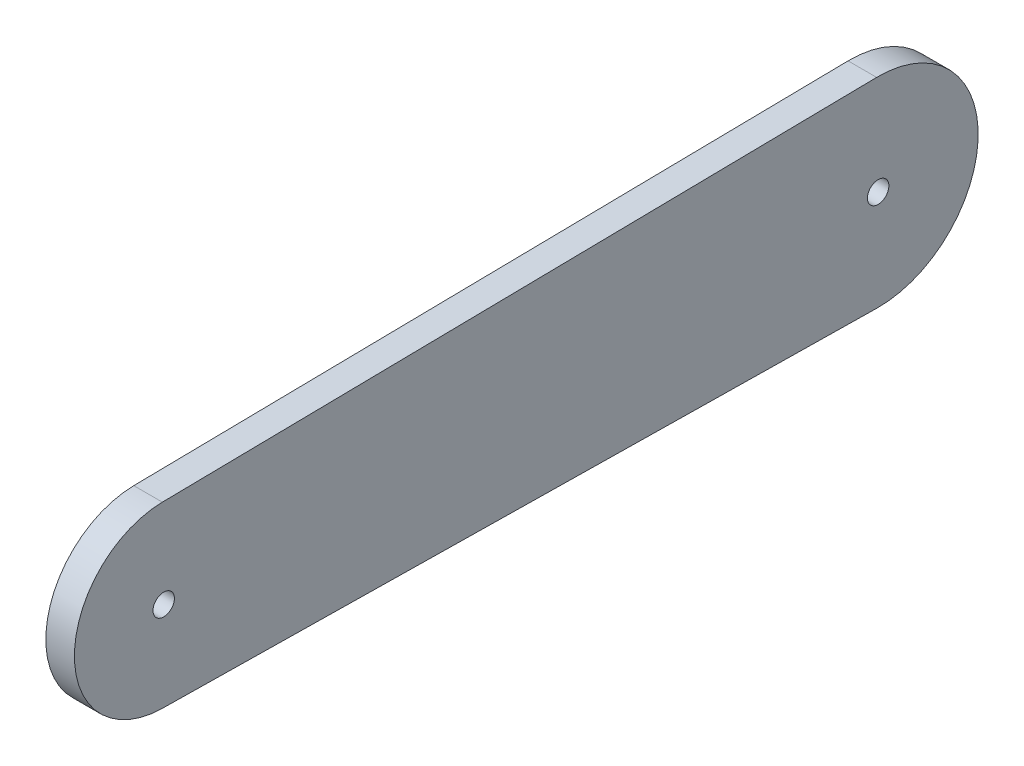
ISO-10303-21;
HEADER;
FILE_DESCRIPTION(('STEP AP214'),'2;1');
FILE_NAME('part.step','',(''),(''),'','','');
FILE_SCHEMA(('AUTOMOTIVE_DESIGN { 1 0 10303 214 1 1 1 1 }'));
ENDSEC;
DATA;
#1=APPLICATION_CONTEXT('core data for automotive mechanical design processes');
#2=APPLICATION_PROTOCOL_DEFINITION('international standard','automotive_design',2000,#1);
#3=PRODUCT_CONTEXT('',#1,'mechanical');
#4=PRODUCT('Part','Part','',(#3));
#5=PRODUCT_RELATED_PRODUCT_CATEGORY('part','',(#4));
#6=PRODUCT_DEFINITION_FORMATION('','',#4);
#7=PRODUCT_DEFINITION_CONTEXT('part definition',#1,'design');
#8=PRODUCT_DEFINITION('design','',#6,#7);
#9=PRODUCT_DEFINITION_SHAPE('','',#8);
#10=(LENGTH_UNIT() NAMED_UNIT(*) SI_UNIT(.MILLI.,.METRE.));
#11=(NAMED_UNIT(*) PLANE_ANGLE_UNIT() SI_UNIT($,.RADIAN.));
#12=(NAMED_UNIT(*) SI_UNIT($,.STERADIAN.) SOLID_ANGLE_UNIT());
#13=UNCERTAINTY_MEASURE_WITH_UNIT(LENGTH_MEASURE(1.E-05),#10,'distance_accuracy_value','');
#14=(GEOMETRIC_REPRESENTATION_CONTEXT(3) GLOBAL_UNCERTAINTY_ASSIGNED_CONTEXT((#13)) GLOBAL_UNIT_ASSIGNED_CONTEXT((#10,
#11,#12)) REPRESENTATION_CONTEXT('',''));
#15=CARTESIAN_POINT('',(0.,0.,0.));
#16=DIRECTION('',(0.,0.,1.));
#17=DIRECTION('',(1.,0.,0.));
#18=AXIS2_PLACEMENT_3D('',#15,#16,#17);
#19=CARTESIAN_POINT('',(4.,0.,100.));
#20=DIRECTION('',(1.,0.,0.));
#21=DIRECTION('',(0.,0.,-1.));
#22=AXIS2_PLACEMENT_3D('',#19,#20,#21);
#23=PLANE('',#22);
#24=CARTESIAN_POINT('',(4.,0.,0.));
#25=DIRECTION('',(1.,0.,0.));
#26=DIRECTION('',(0.,0.,-1.));
#27=AXIS2_PLACEMENT_3D('',#24,#25,#26);
#28=CIRCLE('',#27,1.5);
#29=CARTESIAN_POINT('',(4.,0.,-1.5));
#30=VERTEX_POINT('',#29);
#31=EDGE_CURVE('E100',#30,#30,#28,.T.);
#32=ORIENTED_EDGE('',*,*,#31,.F.);
#33=EDGE_LOOP('',(#32));
#34=FACE_BOUND('',#33,.T.);
#35=CARTESIAN_POINT('',(4.,0.,100.));
#36=DIRECTION('',(1.,0.,0.));
#37=DIRECTION('',(0.,0.,-1.));
#38=AXIS2_PLACEMENT_3D('',#35,#36,#37);
#39=CIRCLE('',#38,12.5);
#40=CARTESIAN_POINT('',(4.,12.4985936708895,100.1875));
#41=VERTEX_POINT('',#40);
#42=CARTESIAN_POINT('',(4.,-12.4985936708896,100.1875));
#43=VERTEX_POINT('',#42);
#44=EDGE_CURVE('E85',#41,#43,#39,.T.);
#45=ORIENTED_EDGE('',*,*,#44,.T.);
#46=DIRECTION('',(0.,-0.0149999999999999,-0.999887493671163));
#47=VECTOR('',#46,1.);
#48=CARTESIAN_POINT('',(4.,-12.4985936708896,100.1875));
#49=LINE('',#48,#47);
#50=CARTESIAN_POINT('',(4.,-13.9984249113963,0.210000000000002));
#51=VERTEX_POINT('',#50);
#52=EDGE_CURVE('E80',#43,#51,#49,.T.);
#53=ORIENTED_EDGE('',*,*,#52,.T.);
#54=CARTESIAN_POINT('',(4.,0.,0.));
#55=DIRECTION('',(1.,0.,0.));
#56=DIRECTION('',(0.,0.,-1.));
#57=AXIS2_PLACEMENT_3D('',#54,#55,#56);
#58=CIRCLE('',#57,14.);
#59=CARTESIAN_POINT('',(4.,13.9984249113963,0.210000000000002));
#60=VERTEX_POINT('',#59);
#61=EDGE_CURVE('E83',#51,#60,#58,.T.);
#62=ORIENTED_EDGE('',*,*,#61,.T.);
#63=DIRECTION('',(0.,-0.0150000000000001,0.999887493671163));
#64=VECTOR('',#63,1.);
#65=CARTESIAN_POINT('',(4.,12.4985936708895,100.1875));
#66=LINE('',#65,#64);
#67=EDGE_CURVE('E50',#60,#41,#66,.T.);
#68=ORIENTED_EDGE('',*,*,#67,.T.);
#69=EDGE_LOOP('',(#45,#53,#62,#68));
#70=FACE_BOUND('',#69,.T.);
#71=CARTESIAN_POINT('',(4.,0.,100.));
#72=DIRECTION('',(1.,0.,0.));
#73=DIRECTION('',(0.,0.,-1.));
#74=AXIS2_PLACEMENT_3D('',#71,#72,#73);
#75=CIRCLE('',#74,1.5);
#76=CARTESIAN_POINT('',(4.,0.,98.5));
#77=VERTEX_POINT('',#76);
#78=EDGE_CURVE('E115',#77,#77,#75,.T.);
#79=ORIENTED_EDGE('',*,*,#78,.F.);
#80=EDGE_LOOP('',(#79));
#81=FACE_BOUND('',#80,.T.);
#82=ADVANCED_FACE('F33',(#34,#70,#81),#23,.T.);
#83=CARTESIAN_POINT('',(0.,0.,100.));
#84=DIRECTION('',(1.,0.,0.));
#85=DIRECTION('',(0.,0.,-1.));
#86=AXIS2_PLACEMENT_3D('',#83,#84,#85);
#87=PLANE('',#86);
#88=CARTESIAN_POINT('',(0.,0.,0.));
#89=DIRECTION('',(1.,0.,0.));
#90=DIRECTION('',(0.,0.,-1.));
#91=AXIS2_PLACEMENT_3D('',#88,#89,#90);
#92=CIRCLE('',#91,1.5);
#93=CARTESIAN_POINT('',(0.,0.,-1.5));
#94=VERTEX_POINT('',#93);
#95=EDGE_CURVE('E112',#94,#94,#92,.T.);
#96=ORIENTED_EDGE('',*,*,#95,.T.);
#97=EDGE_LOOP('',(#96));
#98=FACE_BOUND('',#97,.T.);
#99=CARTESIAN_POINT('',(0.,0.,100.));
#100=DIRECTION('',(1.,0.,0.));
#101=DIRECTION('',(0.,0.,-1.));
#102=AXIS2_PLACEMENT_3D('',#99,#100,#101);
#103=CIRCLE('',#102,12.5);
#104=CARTESIAN_POINT('',(0.,12.4985936708895,100.1875));
#105=VERTEX_POINT('',#104);
#106=CARTESIAN_POINT('',(0.,-12.4985936708896,100.1875));
#107=VERTEX_POINT('',#106);
#108=EDGE_CURVE('E97',#105,#107,#103,.T.);
#109=ORIENTED_EDGE('',*,*,#108,.F.);
#110=DIRECTION('',(0.,-0.0150000000000001,0.999887493671163));
#111=VECTOR('',#110,1.);
#112=CARTESIAN_POINT('',(0.,12.4985936708895,100.1875));
#113=LINE('',#112,#111);
#114=CARTESIAN_POINT('',(0.,13.9984249113963,0.210000000000002));
#115=VERTEX_POINT('',#114);
#116=EDGE_CURVE('E73',#115,#105,#113,.T.);
#117=ORIENTED_EDGE('',*,*,#116,.F.);
#118=CARTESIAN_POINT('',(0.,0.,0.));
#119=DIRECTION('',(1.,0.,0.));
#120=DIRECTION('',(0.,0.,-1.));
#121=AXIS2_PLACEMENT_3D('',#118,#119,#120);
#122=CIRCLE('',#121,14.);
#123=CARTESIAN_POINT('',(0.,-13.9984249113963,0.210000000000002));
#124=VERTEX_POINT('',#123);
#125=EDGE_CURVE('E67',#124,#115,#122,.T.);
#126=ORIENTED_EDGE('',*,*,#125,.F.);
#127=DIRECTION('',(0.,-0.0149999999999999,-0.999887493671163));
#128=VECTOR('',#127,1.);
#129=CARTESIAN_POINT('',(0.,-12.4985936708896,100.1875));
#130=LINE('',#129,#128);
#131=EDGE_CURVE('E89',#107,#124,#130,.T.);
#132=ORIENTED_EDGE('',*,*,#131,.F.);
#133=EDGE_LOOP('',(#109,#117,#126,#132));
#134=FACE_BOUND('',#133,.T.);
#135=CARTESIAN_POINT('',(0.,0.,100.));
#136=DIRECTION('',(1.,0.,0.));
#137=DIRECTION('',(0.,0.,-1.));
#138=AXIS2_PLACEMENT_3D('',#135,#136,#137);
#139=CIRCLE('',#138,1.5);
#140=CARTESIAN_POINT('',(0.,0.,98.5));
#141=VERTEX_POINT('',#140);
#142=EDGE_CURVE('E118',#141,#141,#139,.T.);
#143=ORIENTED_EDGE('',*,*,#142,.T.);
#144=EDGE_LOOP('',(#143));
#145=FACE_BOUND('',#144,.T.);
#146=ADVANCED_FACE('F108',(#98,#134,#145),#87,.F.);
#147=CARTESIAN_POINT('',(4.,0.,100.));
#148=DIRECTION('',(-1.,0.,0.));
#149=DIRECTION('',(0.,0.,1.));
#150=AXIS2_PLACEMENT_3D('',#147,#148,#149);
#151=CYLINDRICAL_SURFACE('',#150,12.5);
#152=ORIENTED_EDGE('',*,*,#108,.T.);
#153=DIRECTION('',(-1.,0.,0.));
#154=VECTOR('',#153,1.);
#155=CARTESIAN_POINT('',(4.,-12.4985936708896,100.1875));
#156=LINE('',#155,#154);
#157=EDGE_CURVE('E11',#43,#107,#156,.T.);
#158=ORIENTED_EDGE('',*,*,#157,.F.);
#159=ORIENTED_EDGE('',*,*,#44,.F.);
#160=DIRECTION('',(-1.,0.,0.));
#161=VECTOR('',#160,1.);
#162=CARTESIAN_POINT('',(4.,12.4985936708895,100.1875));
#163=LINE('',#162,#161);
#164=EDGE_CURVE('E93',#41,#105,#163,.T.);
#165=ORIENTED_EDGE('',*,*,#164,.T.);
#166=EDGE_LOOP('',(#152,#158,#159,#165));
#167=FACE_BOUND('',#166,.T.);
#168=ADVANCED_FACE('F35',(#167),#151,.T.);
#169=CARTESIAN_POINT('',(4.,-12.4985936708896,100.1875));
#170=DIRECTION('',(0.,0.999887493671163,-0.0149999999999999));
#171=DIRECTION('',(0.,0.0149999999999999,0.999887493671163));
#172=AXIS2_PLACEMENT_3D('',#169,#170,#171);
#173=PLANE('',#172);
#174=ORIENTED_EDGE('',*,*,#131,.T.);
#175=DIRECTION('',(-1.,0.,0.));
#176=VECTOR('',#175,1.);
#177=CARTESIAN_POINT('',(4.,-13.9984249113963,0.210000000000002));
#178=LINE('',#177,#176);
#179=EDGE_CURVE('E42',#51,#124,#178,.T.);
#180=ORIENTED_EDGE('',*,*,#179,.F.);
#181=ORIENTED_EDGE('',*,*,#52,.F.);
#182=ORIENTED_EDGE('',*,*,#157,.T.);
#183=EDGE_LOOP('',(#174,#180,#181,#182));
#184=FACE_BOUND('',#183,.T.);
#185=ADVANCED_FACE('F88',(#184),#173,.F.);
#186=CARTESIAN_POINT('',(4.,0.,0.));
#187=DIRECTION('',(-1.,0.,0.));
#188=DIRECTION('',(0.,0.,1.));
#189=AXIS2_PLACEMENT_3D('',#186,#187,#188);
#190=CYLINDRICAL_SURFACE('',#189,14.);
#191=ORIENTED_EDGE('',*,*,#125,.T.);
#192=DIRECTION('',(-1.,0.,0.));
#193=VECTOR('',#192,1.);
#194=CARTESIAN_POINT('',(4.,13.9984249113963,0.210000000000002));
#195=LINE('',#194,#193);
#196=EDGE_CURVE('E90',#60,#115,#195,.T.);
#197=ORIENTED_EDGE('',*,*,#196,.F.);
#198=ORIENTED_EDGE('',*,*,#61,.F.);
#199=ORIENTED_EDGE('',*,*,#179,.T.);
#200=EDGE_LOOP('',(#191,#197,#198,#199));
#201=FACE_BOUND('',#200,.T.);
#202=ADVANCED_FACE('F91',(#201),#190,.T.);
#203=CARTESIAN_POINT('',(4.,12.4985936708895,100.1875));
#204=DIRECTION('',(0.,-0.999887493671163,-0.0150000000000001));
#205=DIRECTION('',(0.,0.0150000000000001,-0.999887493671163));
#206=AXIS2_PLACEMENT_3D('',#203,#204,#205);
#207=PLANE('',#206);
#208=ORIENTED_EDGE('',*,*,#116,.T.);
#209=ORIENTED_EDGE('',*,*,#164,.F.);
#210=ORIENTED_EDGE('',*,*,#67,.F.);
#211=ORIENTED_EDGE('',*,*,#196,.T.);
#212=EDGE_LOOP('',(#208,#209,#210,#211));
#213=FACE_BOUND('',#212,.T.);
#214=ADVANCED_FACE('F105',(#213),#207,.F.);
#215=CARTESIAN_POINT('',(4.,0.,0.));
#216=DIRECTION('',(-1.,0.,0.));
#217=DIRECTION('',(0.,0.,1.));
#218=AXIS2_PLACEMENT_3D('',#215,#216,#217);
#219=CYLINDRICAL_SURFACE('',#218,1.5);
#220=ORIENTED_EDGE('',*,*,#31,.T.);
#221=EDGE_LOOP('',(#220));
#222=FACE_BOUND('',#221,.T.);
#223=ORIENTED_EDGE('',*,*,#95,.F.);
#224=EDGE_LOOP('',(#223));
#225=FACE_BOUND('',#224,.T.);
#226=ADVANCED_FACE('F136',(#222,#225),#219,.F.);
#227=CARTESIAN_POINT('',(4.,0.,100.));
#228=DIRECTION('',(-1.,0.,0.));
#229=DIRECTION('',(0.,0.,1.));
#230=AXIS2_PLACEMENT_3D('',#227,#228,#229);
#231=CYLINDRICAL_SURFACE('',#230,1.5);
#232=ORIENTED_EDGE('',*,*,#78,.T.);
#233=EDGE_LOOP('',(#232));
#234=FACE_BOUND('',#233,.T.);
#235=ORIENTED_EDGE('',*,*,#142,.F.);
#236=EDGE_LOOP('',(#235));
#237=FACE_BOUND('',#236,.T.);
#238=ADVANCED_FACE('F124',(#234,#237),#231,.F.);
#239=CLOSED_SHELL('',(#82,#146,#168,#185,#202,#214,#226,#238));
#240=MANIFOLD_SOLID_BREP('B2',#239);
#241=ADVANCED_BREP_SHAPE_REPRESENTATION('',(#18,#240),#14);
#242=SHAPE_DEFINITION_REPRESENTATION(#9,#241);
ENDSEC;
END-ISO-10303-21;
